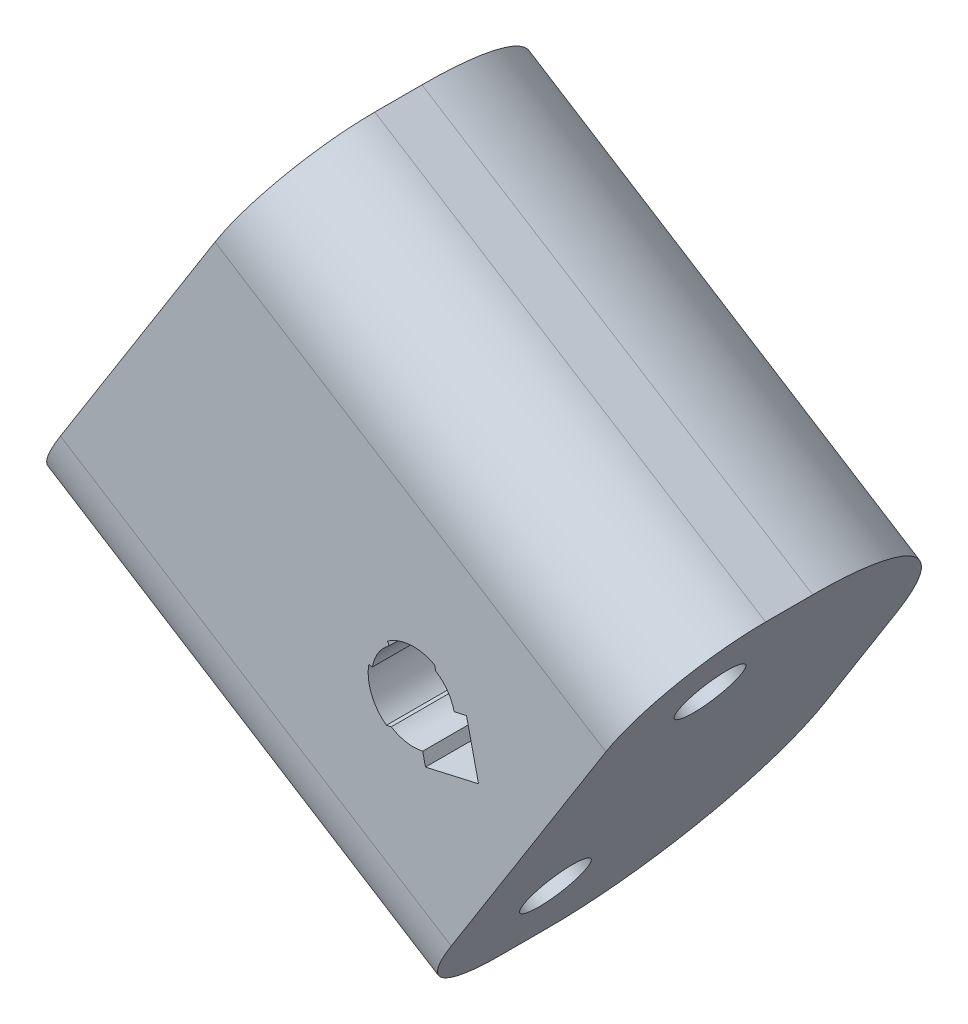
ISO-10303-21;
HEADER;
FILE_DESCRIPTION(('STEP AP214'),'2;1');
FILE_NAME('part.step','',(''),(''),'','','');
FILE_SCHEMA(('AUTOMOTIVE_DESIGN { 1 0 10303 214 1 1 1 1 }'));
ENDSEC;
DATA;
#1=APPLICATION_CONTEXT('core data for automotive mechanical design processes');
#2=APPLICATION_PROTOCOL_DEFINITION('international standard','automotive_design',2000,#1);
#3=PRODUCT_CONTEXT('',#1,'mechanical');
#4=PRODUCT('Part','Part','',(#3));
#5=PRODUCT_RELATED_PRODUCT_CATEGORY('part','',(#4));
#6=PRODUCT_DEFINITION_FORMATION('','',#4);
#7=PRODUCT_DEFINITION_CONTEXT('part definition',#1,'design');
#8=PRODUCT_DEFINITION('design','',#6,#7);
#9=PRODUCT_DEFINITION_SHAPE('','',#8);
#10=(LENGTH_UNIT() NAMED_UNIT(*) SI_UNIT(.MILLI.,.METRE.));
#11=(NAMED_UNIT(*) PLANE_ANGLE_UNIT() SI_UNIT($,.RADIAN.));
#12=(NAMED_UNIT(*) SI_UNIT($,.STERADIAN.) SOLID_ANGLE_UNIT());
#13=UNCERTAINTY_MEASURE_WITH_UNIT(LENGTH_MEASURE(1.E-05),#10,'distance_accuracy_value','');
#14=(GEOMETRIC_REPRESENTATION_CONTEXT(3) GLOBAL_UNCERTAINTY_ASSIGNED_CONTEXT((#13)) GLOBAL_UNIT_ASSIGNED_CONTEXT((#10,
#11,#12)) REPRESENTATION_CONTEXT('',''));
#15=CARTESIAN_POINT('',(0.,0.,0.));
#16=DIRECTION('',(0.,0.,1.));
#17=DIRECTION('',(1.,0.,0.));
#18=AXIS2_PLACEMENT_3D('',#15,#16,#17);
#19=CARTESIAN_POINT('',(44.3935601259802,-18.5113506463066,-1.12499871142424));
#20=DIRECTION('',(-0.846104357870405,0.533017275135347,0.));
#21=DIRECTION('',(-0.533017275135347,-0.846104357870405,0.));
#22=AXIS2_PLACEMENT_3D('',#19,#20,#21);
#23=CYLINDRICAL_SURFACE('',#22,1.75);
#24=CARTESIAN_POINT('',(2.14887730640675,8.10137805080161,-1.12499871142424));
#25=DIRECTION('',(0.846104357870405,-0.533017275135347,0.));
#26=DIRECTION('',(0.533017275135347,0.846104357870405,0.));
#27=AXIS2_PLACEMENT_3D('',#24,#25,#26);
#28=CIRCLE('',#27,1.75);
#29=CARTESIAN_POINT('',(3.08165753789361,9.58206067707482,-1.12499871142424));
#30=VERTEX_POINT('',#29);
#31=EDGE_CURVE('E336',#30,#30,#28,.F.);
#32=ORIENTED_EDGE('',*,*,#31,.T.);
#33=EDGE_LOOP('',(#32));
#34=FACE_BOUND('',#33,.T.);
#35=CARTESIAN_POINT('',(23.7061857745139,-5.47900090841251,-1.12499871142424));
#36=DIRECTION('',(0.846104357870405,-0.533017275135347,0.));
#37=DIRECTION('',(0.533017275135347,0.846104357870405,0.));
#38=AXIS2_PLACEMENT_3D('',#35,#36,#37);
#39=CIRCLE('',#38,1.75);
#40=CARTESIAN_POINT('',(24.6389660060008,-3.9983182821393,-1.12499871142424));
#41=VERTEX_POINT('',#40);
#42=EDGE_CURVE('E328',#41,#41,#39,.F.);
#43=ORIENTED_EDGE('',*,*,#42,.F.);
#44=EDGE_LOOP('',(#43));
#45=FACE_BOUND('',#44,.T.);
#46=ADVANCED_FACE('F86',(#34,#45),#23,.F.);
#47=CARTESIAN_POINT('',(32.8004343917864,-36.914120429988,0.));
#48=DIRECTION('',(0.533017275135347,0.846104357870405,0.));
#49=DIRECTION('',(-0.846104357870405,0.533017275135347,0.));
#50=AXIS2_PLACEMENT_3D('',#47,#48,#49);
#51=PLANE('',#50);
#52=DIRECTION('',(0.,0.,-1.));
#53=VECTOR('',#52,1.);
#54=CARTESIAN_POINT('',(-9.44424842778705,-10.3013917328797,0.));
#55=LINE('',#54,#53);
#56=CARTESIAN_POINT('',(-9.44424842778706,-10.3013917328797,-1.12499871142424));
#57=VERTEX_POINT('',#56);
#58=CARTESIAN_POINT('',(-9.44424842778705,-10.3013917328797,-3.72499871142426));
#59=VERTEX_POINT('',#58);
#60=EDGE_CURVE('E339',#57,#59,#55,.T.);
#61=ORIENTED_EDGE('',*,*,#60,.T.);
#62=DIRECTION('',(-0.846104357870405,0.533017275135347,0.));
#63=VECTOR('',#62,1.);
#64=CARTESIAN_POINT('',(12.1130600403201,-23.8817706920938,-3.72499871142427));
#65=LINE('',#64,#63);
#66=CARTESIAN_POINT('',(12.1130600403201,-23.8817706920938,-3.72499871142427));
#67=VERTEX_POINT('',#66);
#68=EDGE_CURVE('E376',#59,#67,#65,.F.);
#69=ORIENTED_EDGE('',*,*,#68,.T.);
#70=DIRECTION('',(0.,0.,-1.));
#71=VECTOR('',#70,1.);
#72=CARTESIAN_POINT('',(12.1130600403201,-23.8817706920938,0.));
#73=LINE('',#72,#71);
#74=CARTESIAN_POINT('',(12.1130600403201,-23.8817706920938,-1.12499871142424));
#75=VERTEX_POINT('',#74);
#76=EDGE_CURVE('E322',#75,#67,#73,.T.);
#77=ORIENTED_EDGE('',*,*,#76,.F.);
#78=DIRECTION('',(-0.846104357870405,0.533017275135347,0.));
#79=VECTOR('',#78,1.);
#80=CARTESIAN_POINT('',(32.8004343917864,-36.914120429988,-1.12499871142424));
#81=LINE('',#80,#79);
#82=EDGE_CURVE('E342',#75,#57,#81,.T.);
#83=ORIENTED_EDGE('',*,*,#82,.T.);
#84=EDGE_LOOP('',(#61,#69,#77,#83));
#85=FACE_BOUND('',#84,.T.);
#86=ADVANCED_FACE('F457',(#85),#51,.F.);
#87=CARTESIAN_POINT('',(35.8652837238147,-32.0490203722331,-1.12499871142424));
#88=DIRECTION('',(-0.846104357870405,0.533017275135347,0.));
#89=DIRECTION('',(-0.533017275135347,-0.846104357870405,0.));
#90=AXIS2_PLACEMENT_3D('',#87,#88,#89);
#91=CYLINDRICAL_SURFACE('',#90,5.75);
#92=ORIENTED_EDGE('',*,*,#82,.F.);
#93=CARTESIAN_POINT('',(15.1779093723484,-19.016670634339,-1.12499871142424));
#94=DIRECTION('',(0.846104357870405,-0.533017275135347,0.));
#95=DIRECTION('',(0.533017275135347,0.846104357870405,0.));
#96=AXIS2_PLACEMENT_3D('',#93,#94,#95);
#97=CIRCLE('',#96,5.75);
#98=CARTESIAN_POINT('',(15.1779093723484,-19.016670634339,4.62500128857576));
#99=VERTEX_POINT('',#98);
#100=EDGE_CURVE('E319',#99,#75,#97,.T.);
#101=ORIENTED_EDGE('',*,*,#100,.F.);
#102=DIRECTION('',(-0.846104357870405,0.533017275135347,0.));
#103=VECTOR('',#102,1.);
#104=CARTESIAN_POINT('',(35.8652837238147,-32.0490203722331,4.62500128857576));
#105=LINE('',#104,#103);
#106=CARTESIAN_POINT('',(-6.37939909575881,-5.43629167512487,4.62500128857576));
#107=VERTEX_POINT('',#106);
#108=EDGE_CURVE('E346',#99,#107,#105,.T.);
#109=ORIENTED_EDGE('',*,*,#108,.T.);
#110=CARTESIAN_POINT('',(-6.37939909575881,-5.43629167512487,-1.12499871142424));
#111=DIRECTION('',(0.846104357870405,-0.533017275135347,0.));
#112=DIRECTION('',(0.533017275135347,0.846104357870405,0.));
#113=AXIS2_PLACEMENT_3D('',#110,#111,#112);
#114=CIRCLE('',#113,5.75);
#115=EDGE_CURVE('E343',#107,#57,#114,.T.);
#116=ORIENTED_EDGE('',*,*,#115,.T.);
#117=EDGE_LOOP('',(#92,#101,#109,#116));
#118=FACE_BOUND('',#117,.T.);
#119=ADVANCED_FACE('F463',(#118),#91,.T.);
#120=CARTESIAN_POINT('',(40.1294219248975,-25.2801855092699,4.62500128857576));
#121=DIRECTION('',(0.,0.,-1.));
#122=DIRECTION('',(0.,1.,0.));
#123=AXIS2_PLACEMENT_3D('',#120,#121,#122);
#124=PLANE('',#123);
#125=DIRECTION('',(0.985675378963754,-0.168653631163577,0.));
#126=VECTOR('',#125,1.);
#127=CARTESIAN_POINT('',(-0.998984788937356,-5.83844358180357,4.62500128857576));
#128=LINE('',#127,#126);
#129=CARTESIAN_POINT('',(10.6320764419937,-7.82857212995165,4.62500128857576));
#130=VERTEX_POINT('',#129);
#131=CARTESIAN_POINT('',(10.8292115177865,-7.86230285618436,4.62500128857576));
#132=VERTEX_POINT('',#131);
#133=EDGE_CURVE('E395',#130,#132,#128,.T.);
#134=ORIENTED_EDGE('',*,*,#133,.T.);
#135=CARTESIAN_POINT('',(13.0962648894031,-8.25020620786059,4.62500128857576));
#136=DIRECTION('',(0.,0.,-1.));
#137=DIRECTION('',(0.,1.,0.));
#138=AXIS2_PLACEMENT_3D('',#135,#136,#137);
#139=CIRCLE('',#138,2.3);
#140=CARTESIAN_POINT('',(11.7675051674364,-6.37286830506339,4.62500128857576));
#141=VERTEX_POINT('',#140);
#142=EDGE_CURVE('E305',#141,#132,#139,.F.);
#143=ORIENTED_EDGE('',*,*,#142,.F.);
#144=DIRECTION('',(0.577721618246388,-0.816233870781392,0.));
#145=VECTOR('',#144,1.);
#146=CARTESIAN_POINT('',(4.83479196682832,3.42201412970863,4.62500128857576));
#147=LINE('',#146,#145);
#148=CARTESIAN_POINT('',(11.6519608437872,-6.20962153090711,4.62500128857576));
#149=VERTEX_POINT('',#148);
#150=EDGE_CURVE('E302',#149,#141,#147,.T.);
#151=ORIENTED_EDGE('',*,*,#150,.F.);
#152=CARTESIAN_POINT('',(13.0962648894031,-8.25020620786059,4.62500128857576));
#153=DIRECTION('',(0.,0.,-1.));
#154=DIRECTION('',(0.,1.,0.));
#155=AXIS2_PLACEMENT_3D('',#152,#153,#154);
#156=CIRCLE('',#155,2.5);
#157=CARTESIAN_POINT('',(14.2619127669846,-6.03858575545703,4.62500128857576));
#158=VERTEX_POINT('',#157);
#159=EDGE_CURVE('E237',#158,#149,#156,.F.);
#160=ORIENTED_EDGE('',*,*,#159,.F.);
#161=DIRECTION('',(0.221385999303831,-0.975186258779442,0.));
#162=VECTOR('',#161,1.);
#163=CARTESIAN_POINT('',(19.6838436344012,-29.9217242311665,4.62500128857576));
#164=LINE('',#163,#162);
#165=CARTESIAN_POINT('',(14.3222046222145,-6.3041661847587,4.62500128857576));
#166=VERTEX_POINT('',#165);
#167=EDGE_CURVE('E383',#158,#166,#164,.T.);
#168=ORIENTED_EDGE('',*,*,#167,.T.);
#169=CARTESIAN_POINT('',(13.0962648894031,-8.25020620786059,4.62500128857576));
#170=DIRECTION('',(0.,0.,-1.));
#171=DIRECTION('',(0.,1.,0.));
#172=AXIS2_PLACEMENT_3D('',#169,#170,#171);
#173=CIRCLE('',#172,2.3);
#174=CARTESIAN_POINT('',(15.3391932845958,-7.74101840946177,4.62500128857576));
#175=VERTEX_POINT('',#174);
#176=EDGE_CURVE('E415',#175,#166,#173,.F.);
#177=ORIENTED_EDGE('',*,*,#176,.F.);
#178=DIRECTION('',(-0.97518625877944,-0.221385999303837,0.));
#179=VECTOR('',#178,1.);
#180=CARTESIAN_POINT('',(2.42302934077073,-10.6732355486315,4.62500128857576));
#181=LINE('',#180,#179);
#182=CARTESIAN_POINT('',(16.0218236657415,-7.58604820994908,4.62500128857576));
#183=VERTEX_POINT('',#182);
#184=EDGE_CURVE('E430',#183,#175,#181,.T.);
#185=ORIENTED_EDGE('',*,*,#184,.F.);
#186=DIRECTION('',(0.221385999303835,-0.975186258779441,0.));
#187=VECTOR('',#186,1.);
#188=CARTESIAN_POINT('',(13.5987943249708,3.08718733868242,4.62500128857576));
#189=LINE('',#188,#187);
#190=CARTESIAN_POINT('',(16.6859816636529,-10.5116069862873,4.62500128857576));
#191=VERTEX_POINT('',#190);
#192=EDGE_CURVE('E433',#183,#191,#189,.T.);
#193=ORIENTED_EDGE('',*,*,#192,.T.);
#194=DIRECTION('',(0.975186258779432,0.221385999303876,0.));
#195=VECTOR('',#194,1.);
#196=CARTESIAN_POINT('',(3.08718733868289,-13.5987943249701,4.62500128857576));
#197=LINE('',#196,#195);
#198=CARTESIAN_POINT('',(13.7604228873148,-11.1757649841989,4.62500128857576));
#199=VERTEX_POINT('',#198);
#200=EDGE_CURVE('E437',#199,#191,#197,.T.);
#201=ORIENTED_EDGE('',*,*,#200,.F.);
#202=DIRECTION('',(-0.221385999303876,0.975186258779431,0.));
#203=VECTOR('',#202,1.);
#204=CARTESIAN_POINT('',(10.6732355486319,2.42302934077127,4.62500128857576));
#205=LINE('',#204,#203);
#206=CARTESIAN_POINT('',(13.605452687802,-10.4931346030533,4.62500128857576));
#207=VERTEX_POINT('',#206);
#208=EDGE_CURVE('E399',#199,#207,#205,.T.);
#209=ORIENTED_EDGE('',*,*,#208,.T.);
#210=CARTESIAN_POINT('',(13.0962648894031,-8.25020620786059,4.62500128857576));
#211=DIRECTION('',(0.,0.,-1.));
#212=DIRECTION('',(0.,1.,0.));
#213=AXIS2_PLACEMENT_3D('',#210,#211,#212);
#214=CIRCLE('',#213,2.3);
#215=CARTESIAN_POINT('',(11.8703251565918,-10.1962462309625,4.62500128857576));
#216=VERTEX_POINT('',#215);
#217=EDGE_CURVE('E396',#216,#207,#214,.F.);
#218=ORIENTED_EDGE('',*,*,#217,.F.);
#219=DIRECTION('',(-0.975186258779435,-0.22138599930386,0.));
#220=VECTOR('',#219,1.);
#221=CARTESIAN_POINT('',(35.4878832030005,-4.8346072187749,4.62500128857576));
#222=LINE('',#221,#220);
#223=CARTESIAN_POINT('',(11.6047447272902,-10.2565380861924,4.62500128857576));
#224=VERTEX_POINT('',#223);
#225=EDGE_CURVE('E12',#216,#224,#222,.T.);
#226=ORIENTED_EDGE('',*,*,#225,.T.);
#227=CARTESIAN_POINT('',(13.0962648894031,-8.25020620786059,4.62500128857576));
#228=DIRECTION('',(0.,0.,-1.));
#229=DIRECTION('',(0.,1.,0.));
#230=AXIS2_PLACEMENT_3D('',#227,#228,#229);
#231=CIRCLE('',#230,2.5);
#232=EDGE_CURVE('E393',#130,#224,#231,.F.);
#233=ORIENTED_EDGE('',*,*,#232,.F.);
#234=EDGE_LOOP('',(#134,#143,#151,#160,#168,#177,#185,#193,#201,#209,#218,#226,#233));
#235=FACE_BOUND('',#234,.T.);
#236=ORIENTED_EDGE('',*,*,#108,.F.);
#237=DIRECTION('',(-0.533017275135347,-0.846104357870405,0.));
#238=VECTOR('',#237,1.);
#239=CARTESIAN_POINT('',(19.4420475734311,-12.2478357713757,4.62500128857576));
#240=LINE('',#239,#238);
#241=CARTESIAN_POINT('',(23.7061857745139,-5.47900090841252,4.62500128857576));
#242=VERTEX_POINT('',#241);
#243=EDGE_CURVE('E316',#242,#99,#240,.T.);
#244=ORIENTED_EDGE('',*,*,#243,.F.);
#245=DIRECTION('',(-0.846104357870405,0.533017275135347,0.));
#246=VECTOR('',#245,1.);
#247=CARTESIAN_POINT('',(44.3935601259802,-18.5113506463066,4.62500128857576));
#248=LINE('',#247,#246);
#249=CARTESIAN_POINT('',(2.14887730640674,8.10137805080161,4.62500128857576));
#250=VERTEX_POINT('',#249);
#251=EDGE_CURVE('E350',#242,#250,#248,.T.);
#252=ORIENTED_EDGE('',*,*,#251,.T.);
#253=DIRECTION('',(-0.533017275135347,-0.846104357870405,0.));
#254=VECTOR('',#253,1.);
#255=CARTESIAN_POINT('',(-2.11526089467602,1.33254318783837,4.62500128857576));
#256=LINE('',#255,#254);
#257=EDGE_CURVE('E347',#250,#107,#256,.T.);
#258=ORIENTED_EDGE('',*,*,#257,.T.);
#259=EDGE_LOOP('',(#236,#244,#252,#258));
#260=FACE_BOUND('',#259,.T.);
#261=ADVANCED_FACE('F410',(#235,#260),#124,.F.);
#262=CARTESIAN_POINT('',(44.3935601259802,-18.5113506463066,-1.12499871142424));
#263=DIRECTION('',(-0.846104357870405,0.533017275135347,0.));
#264=DIRECTION('',(-0.533017275135347,-0.846104357870405,0.));
#265=AXIS2_PLACEMENT_3D('',#262,#263,#264);
#266=CYLINDRICAL_SURFACE('',#265,5.75);
#267=ORIENTED_EDGE('',*,*,#251,.F.);
#268=CARTESIAN_POINT('',(23.7061857745139,-5.47900090841252,-1.12499871142424));
#269=DIRECTION('',(0.846104357870405,-0.533017275135347,0.));
#270=DIRECTION('',(0.533017275135347,0.846104357870405,0.));
#271=AXIS2_PLACEMENT_3D('',#268,#269,#270);
#272=CIRCLE('',#271,5.75);
#273=CARTESIAN_POINT('',(26.7710351065421,-0.613900850657684,-1.12499871142424));
#274=VERTEX_POINT('',#273);
#275=EDGE_CURVE('E313',#274,#242,#272,.T.);
#276=ORIENTED_EDGE('',*,*,#275,.F.);
#277=DIRECTION('',(-0.846104357870405,0.533017275135347,0.));
#278=VECTOR('',#277,1.);
#279=CARTESIAN_POINT('',(47.4584094580085,-13.6462505885518,-1.12499871142424));
#280=LINE('',#279,#278);
#281=CARTESIAN_POINT('',(5.21372663843499,12.9664781085564,-1.12499871142424));
#282=VERTEX_POINT('',#281);
#283=EDGE_CURVE('E331',#274,#282,#280,.T.);
#284=ORIENTED_EDGE('',*,*,#283,.T.);
#285=CARTESIAN_POINT('',(2.14887730640674,8.10137805080161,-1.12499871142424));
#286=DIRECTION('',(0.846104357870405,-0.533017275135347,0.));
#287=DIRECTION('',(0.533017275135347,0.846104357870405,0.));
#288=AXIS2_PLACEMENT_3D('',#285,#286,#287);
#289=CIRCLE('',#288,5.75);
#290=EDGE_CURVE('E351',#282,#250,#289,.T.);
#291=ORIENTED_EDGE('',*,*,#290,.T.);
#292=EDGE_LOOP('',(#267,#276,#284,#291));
#293=FACE_BOUND('',#292,.T.);
#294=ADVANCED_FACE('F476',(#293),#266,.T.);
#295=CARTESIAN_POINT('',(47.4584094580085,-13.6462505885518,0.));
#296=DIRECTION('',(0.533017275135347,0.846104357870405,0.));
#297=DIRECTION('',(-0.846104357870405,0.533017275135347,0.));
#298=AXIS2_PLACEMENT_3D('',#295,#296,#297);
#299=PLANE('',#298);
#300=DIRECTION('',(0.,0.,1.));
#301=VECTOR('',#300,1.);
#302=CARTESIAN_POINT('',(26.7710351065421,-0.613900850657682,0.));
#303=LINE('',#302,#301);
#304=CARTESIAN_POINT('',(26.7710351065421,-0.613900850657682,-3.72499871142427));
#305=VERTEX_POINT('',#304);
#306=EDGE_CURVE('E311',#305,#274,#303,.T.);
#307=ORIENTED_EDGE('',*,*,#306,.F.);
#308=DIRECTION('',(-0.846104357870405,0.533017275135347,0.));
#309=VECTOR('',#308,1.);
#310=CARTESIAN_POINT('',(47.4584094580085,-13.6462505885518,-3.72499871142427));
#311=LINE('',#310,#309);
#312=CARTESIAN_POINT('',(5.213726638435,12.9664781085564,-3.72499871142427));
#313=VERTEX_POINT('',#312);
#314=EDGE_CURVE('E356',#305,#313,#311,.T.);
#315=ORIENTED_EDGE('',*,*,#314,.T.);
#316=DIRECTION('',(0.,0.,-1.));
#317=VECTOR('',#316,1.);
#318=CARTESIAN_POINT('',(5.213726638435,12.9664781085564,0.));
#319=LINE('',#318,#317);
#320=EDGE_CURVE('E335',#282,#313,#319,.T.);
#321=ORIENTED_EDGE('',*,*,#320,.F.);
#322=ORIENTED_EDGE('',*,*,#283,.F.);
#323=EDGE_LOOP('',(#307,#315,#321,#322));
#324=FACE_BOUND('',#323,.T.);
#325=ADVANCED_FACE('F479',(#324),#299,.T.);
#326=CARTESIAN_POINT('',(35.8652837238147,-32.0490203722331,-1.12499871142424));
#327=DIRECTION('',(-0.846104357870405,0.533017275135347,0.));
#328=DIRECTION('',(-0.533017275135347,-0.846104357870405,0.));
#329=AXIS2_PLACEMENT_3D('',#326,#327,#328);
#330=CYLINDRICAL_SURFACE('',#329,1.75);
#331=CARTESIAN_POINT('',(-6.3793990957588,-5.43629167512487,-1.12499871142424));
#332=DIRECTION('',(0.846104357870405,-0.533017275135347,0.));
#333=DIRECTION('',(0.533017275135347,0.846104357870405,0.));
#334=AXIS2_PLACEMENT_3D('',#331,#332,#333);
#335=CIRCLE('',#334,1.75);
#336=CARTESIAN_POINT('',(-5.44661886427194,-3.95560904885166,-1.12499871142424));
#337=VERTEX_POINT('',#336);
#338=EDGE_CURVE('E332',#337,#337,#335,.F.);
#339=ORIENTED_EDGE('',*,*,#338,.T.);
#340=EDGE_LOOP('',(#339));
#341=FACE_BOUND('',#340,.T.);
#342=CARTESIAN_POINT('',(15.1779093723484,-19.016670634339,-1.12499871142424));
#343=DIRECTION('',(0.846104357870405,-0.533017275135347,0.));
#344=DIRECTION('',(0.533017275135347,0.846104357870405,0.));
#345=AXIS2_PLACEMENT_3D('',#342,#343,#344);
#346=CIRCLE('',#345,1.75);
#347=CARTESIAN_POINT('',(16.1106896038352,-17.5359880080658,-1.12499871142424));
#348=VERTEX_POINT('',#347);
#349=EDGE_CURVE('E325',#348,#348,#346,.F.);
#350=ORIENTED_EDGE('',*,*,#349,.F.);
#351=EDGE_LOOP('',(#350));
#352=FACE_BOUND('',#351,.T.);
#353=ADVANCED_FACE('F483',(#341,#352),#330,.F.);
#354=CARTESIAN_POINT('',(-2.11526089467602,1.33254318783837,0.));
#355=DIRECTION('',(0.846104357870405,-0.533017275135347,0.));
#356=DIRECTION('',(0.533017275135347,0.846104357870405,0.));
#357=AXIS2_PLACEMENT_3D('',#354,#355,#356);
#358=PLANE('',#357);
#359=ORIENTED_EDGE('',*,*,#320,.T.);
#360=CARTESIAN_POINT('',(-0.116446112918479,4.50543452985238,-3.72499871142427));
#361=DIRECTION('',(0.846104357870405,-0.533017275135347,0.));
#362=DIRECTION('',(0.533017275135347,0.846104357870405,0.));
#363=AXIS2_PLACEMENT_3D('',#360,#361,#362);
#364=CIRCLE('',#363,10.);
#365=CARTESIAN_POINT('',(-0.116446112918479,4.50543452985237,-13.7249987114243));
#366=VERTEX_POINT('',#365);
#367=EDGE_CURVE('E365',#313,#366,#364,.F.);
#368=ORIENTED_EDGE('',*,*,#367,.T.);
#369=DIRECTION('',(0.533017275135347,0.846104357870405,0.));
#370=VECTOR('',#369,1.);
#371=CARTESIAN_POINT('',(5.21372663843499,12.9664781085564,-13.7249987114243));
#372=LINE('',#371,#370);
#373=CARTESIAN_POINT('',(-4.11407567643359,-1.84034815417567,-13.7249987114243));
#374=VERTEX_POINT('',#373);
#375=EDGE_CURVE('E304',#374,#366,#372,.T.);
#376=ORIENTED_EDGE('',*,*,#375,.F.);
#377=CARTESIAN_POINT('',(-4.11407567643358,-1.84034815417566,-3.72499871142426));
#378=DIRECTION('',(0.846104357870405,-0.533017275135347,0.));
#379=DIRECTION('',(0.533017275135347,0.846104357870405,0.));
#380=AXIS2_PLACEMENT_3D('',#377,#378,#379);
#381=CIRCLE('',#380,10.);
#382=EDGE_CURVE('E363',#374,#59,#381,.F.);
#383=ORIENTED_EDGE('',*,*,#382,.T.);
#384=ORIENTED_EDGE('',*,*,#60,.F.);
#385=ORIENTED_EDGE('',*,*,#115,.F.);
#386=ORIENTED_EDGE('',*,*,#257,.F.);
#387=ORIENTED_EDGE('',*,*,#290,.F.);
#388=EDGE_LOOP('',(#359,#368,#376,#383,#384,#385,#386,#387));
#389=FACE_BOUND('',#388,.T.);
#390=ORIENTED_EDGE('',*,*,#31,.F.);
#391=EDGE_LOOP('',(#390));
#392=FACE_BOUND('',#391,.T.);
#393=ORIENTED_EDGE('',*,*,#338,.F.);
#394=EDGE_LOOP('',(#393));
#395=FACE_BOUND('',#394,.T.);
#396=ADVANCED_FACE('F468',(#389,#392,#395),#358,.F.);
#397=CARTESIAN_POINT('',(19.4420475734311,-12.2478357713757,-13.7249987114243));
#398=DIRECTION('',(0.,0.,-1.));
#399=DIRECTION('',(-1.,0.,0.));
#400=AXIS2_PLACEMENT_3D('',#397,#398,#399);
#401=PLANE('',#400);
#402=CARTESIAN_POINT('',(13.0962648894031,-8.25020620786059,-13.7249987114243));
#403=DIRECTION('',(0.,0.,-1.));
#404=DIRECTION('',(-1.,0.,0.));
#405=AXIS2_PLACEMENT_3D('',#402,#403,#404);
#406=CIRCLE('',#405,2.3);
#407=CARTESIAN_POINT('',(10.8292115177865,-7.86230285618436,-13.7249987114243));
#408=VERTEX_POINT('',#407);
#409=CARTESIAN_POINT('',(11.7675051674364,-6.37286830506339,-13.7249987114243));
#410=VERTEX_POINT('',#409);
#411=EDGE_CURVE('E250',#408,#410,#406,.T.);
#412=ORIENTED_EDGE('',*,*,#411,.F.);
#413=DIRECTION('',(-0.985675378963754,0.168653631163577,0.));
#414=VECTOR('',#413,1.);
#415=CARTESIAN_POINT('',(-0.998984788937357,-5.83844358180357,-13.7249987114243));
#416=LINE('',#415,#414);
#417=CARTESIAN_POINT('',(10.6320764419937,-7.82857212995165,-13.7249987114243));
#418=VERTEX_POINT('',#417);
#419=EDGE_CURVE('E279',#408,#418,#416,.T.);
#420=ORIENTED_EDGE('',*,*,#419,.T.);
#421=CARTESIAN_POINT('',(13.0962648894031,-8.25020620786059,-13.7249987114243));
#422=DIRECTION('',(0.,0.,-1.));
#423=DIRECTION('',(-1.,0.,0.));
#424=AXIS2_PLACEMENT_3D('',#421,#422,#423);
#425=CIRCLE('',#424,2.5);
#426=CARTESIAN_POINT('',(11.6047447272902,-10.2565380861924,-13.7249987114243));
#427=VERTEX_POINT('',#426);
#428=EDGE_CURVE('E277',#427,#418,#425,.T.);
#429=ORIENTED_EDGE('',*,*,#428,.F.);
#430=DIRECTION('',(0.975186258779435,0.22138599930386,0.));
#431=VECTOR('',#430,1.);
#432=CARTESIAN_POINT('',(11.6047447272901,-10.2565380861924,-13.7249987114243));
#433=LINE('',#432,#431);
#434=CARTESIAN_POINT('',(11.8703251565918,-10.1962462309625,-13.7249987114243));
#435=VERTEX_POINT('',#434);
#436=EDGE_CURVE('E95',#427,#435,#433,.T.);
#437=ORIENTED_EDGE('',*,*,#436,.T.);
#438=CARTESIAN_POINT('',(13.0962648894031,-8.25020620786059,-13.7249987114243));
#439=DIRECTION('',(0.,0.,-1.));
#440=DIRECTION('',(-1.,0.,0.));
#441=AXIS2_PLACEMENT_3D('',#438,#439,#440);
#442=CIRCLE('',#441,2.3);
#443=CARTESIAN_POINT('',(13.605452687802,-10.4931346030533,-13.7249987114243));
#444=VERTEX_POINT('',#443);
#445=EDGE_CURVE('E274',#444,#435,#442,.T.);
#446=ORIENTED_EDGE('',*,*,#445,.F.);
#447=DIRECTION('',(0.221385999303876,-0.975186258779432,0.));
#448=VECTOR('',#447,1.);
#449=CARTESIAN_POINT('',(10.6732355486319,2.42302934077127,-13.7249987114243));
#450=LINE('',#449,#448);
#451=CARTESIAN_POINT('',(13.7604228873148,-11.1757649841989,-13.7249987114243));
#452=VERTEX_POINT('',#451);
#453=EDGE_CURVE('E271',#444,#452,#450,.T.);
#454=ORIENTED_EDGE('',*,*,#453,.T.);
#455=DIRECTION('',(-0.975186258779431,-0.221385999303876,0.));
#456=VECTOR('',#455,1.);
#457=CARTESIAN_POINT('',(3.08718733868289,-13.5987943249701,-13.7249987114243));
#458=LINE('',#457,#456);
#459=CARTESIAN_POINT('',(16.6859816636529,-10.5116069862873,-13.7249987114243));
#460=VERTEX_POINT('',#459);
#461=EDGE_CURVE('E268',#460,#452,#458,.T.);
#462=ORIENTED_EDGE('',*,*,#461,.F.);
#463=DIRECTION('',(-0.221385999303835,0.975186258779441,0.));
#464=VECTOR('',#463,1.);
#465=CARTESIAN_POINT('',(13.5987943249708,3.08718733868242,-13.7249987114243));
#466=LINE('',#465,#464);
#467=CARTESIAN_POINT('',(16.0218236657415,-7.58604820994908,-13.7249987114243));
#468=VERTEX_POINT('',#467);
#469=EDGE_CURVE('E265',#460,#468,#466,.T.);
#470=ORIENTED_EDGE('',*,*,#469,.T.);
#471=DIRECTION('',(0.97518625877944,0.221385999303837,0.));
#472=VECTOR('',#471,1.);
#473=CARTESIAN_POINT('',(2.42302934077073,-10.6732355486315,-13.7249987114243));
#474=LINE('',#473,#472);
#475=CARTESIAN_POINT('',(15.3391932845958,-7.74101840946177,-13.7249987114243));
#476=VERTEX_POINT('',#475);
#477=EDGE_CURVE('E259',#476,#468,#474,.T.);
#478=ORIENTED_EDGE('',*,*,#477,.F.);
#479=CARTESIAN_POINT('',(13.0962648894031,-8.25020620786059,-13.7249987114243));
#480=DIRECTION('',(0.,0.,-1.));
#481=DIRECTION('',(-1.,0.,0.));
#482=AXIS2_PLACEMENT_3D('',#479,#480,#481);
#483=CIRCLE('',#482,2.3);
#484=CARTESIAN_POINT('',(14.3222046222145,-6.3041661847587,-13.7249987114243));
#485=VERTEX_POINT('',#484);
#486=EDGE_CURVE('E256',#485,#476,#483,.T.);
#487=ORIENTED_EDGE('',*,*,#486,.F.);
#488=DIRECTION('',(-0.221385999303831,0.975186258779442,0.));
#489=VECTOR('',#488,1.);
#490=CARTESIAN_POINT('',(14.3222046222145,-6.3041661847587,-13.7249987114243));
#491=LINE('',#490,#489);
#492=CARTESIAN_POINT('',(14.2619127669846,-6.03858575545703,-13.7249987114243));
#493=VERTEX_POINT('',#492);
#494=EDGE_CURVE('E255',#485,#493,#491,.T.);
#495=ORIENTED_EDGE('',*,*,#494,.T.);
#496=CARTESIAN_POINT('',(13.0962648894031,-8.25020620786059,-13.7249987114243));
#497=DIRECTION('',(0.,0.,-1.));
#498=DIRECTION('',(-1.,0.,0.));
#499=AXIS2_PLACEMENT_3D('',#496,#497,#498);
#500=CIRCLE('',#499,2.5);
#501=CARTESIAN_POINT('',(11.6519608437872,-6.20962153090711,-13.7249987114243));
#502=VERTEX_POINT('',#501);
#503=EDGE_CURVE('E234',#502,#493,#500,.T.);
#504=ORIENTED_EDGE('',*,*,#503,.F.);
#505=DIRECTION('',(-0.577721618246388,0.816233870781392,0.));
#506=VECTOR('',#505,1.);
#507=CARTESIAN_POINT('',(4.83479196682832,3.42201412970863,-13.7249987114243));
#508=LINE('',#507,#506);
#509=EDGE_CURVE('E245',#410,#502,#508,.T.);
#510=ORIENTED_EDGE('',*,*,#509,.F.);
#511=EDGE_LOOP('',(#412,#420,#429,#437,#446,#454,#462,#470,#478,#487,#495,#504,#510));
#512=FACE_BOUND('',#511,.T.);
#513=ORIENTED_EDGE('',*,*,#375,.T.);
#514=DIRECTION('',(-0.846104357870405,0.533017275135347,0.));
#515=VECTOR('',#514,1.);
#516=CARTESIAN_POINT('',(21.4408623551887,-9.07494442936174,-13.7249987114243));
#517=LINE('',#516,#515);
#518=CARTESIAN_POINT('',(21.4408623551887,-9.07494442936174,-13.7249987114243));
#519=VERTEX_POINT('',#518);
#520=EDGE_CURVE('E370',#366,#519,#517,.F.);
#521=ORIENTED_EDGE('',*,*,#520,.T.);
#522=DIRECTION('',(-0.533017275135347,-0.846104357870405,0.));
#523=VECTOR('',#522,1.);
#524=CARTESIAN_POINT('',(19.4420475734311,-12.2478357713757,-13.7249987114243));
#525=LINE('',#524,#523);
#526=CARTESIAN_POINT('',(17.4432327916736,-15.4207271133898,-13.7249987114243));
#527=VERTEX_POINT('',#526);
#528=EDGE_CURVE('E308',#519,#527,#525,.T.);
#529=ORIENTED_EDGE('',*,*,#528,.T.);
#530=DIRECTION('',(-0.846104357870405,0.533017275135347,0.));
#531=VECTOR('',#530,1.);
#532=CARTESIAN_POINT('',(-4.11407567643359,-1.84034815417566,-13.7249987114243));
#533=LINE('',#532,#531);
#534=EDGE_CURVE('E367',#527,#374,#533,.T.);
#535=ORIENTED_EDGE('',*,*,#534,.T.);
#536=EDGE_LOOP('',(#513,#521,#529,#535));
#537=FACE_BOUND('',#536,.T.);
#538=ADVANCED_FACE('F252',(#512,#537),#401,.T.);
#539=CARTESIAN_POINT('',(19.4420475734311,-12.2478357713757,0.));
#540=DIRECTION('',(0.846104357870405,-0.533017275135347,0.));
#541=DIRECTION('',(0.533017275135347,0.846104357870405,0.));
#542=AXIS2_PLACEMENT_3D('',#539,#540,#541);
#543=PLANE('',#542);
#544=ORIENTED_EDGE('',*,*,#528,.F.);
#545=CARTESIAN_POINT('',(21.4408623551887,-9.07494442936173,-3.72499871142427));
#546=DIRECTION('',(0.846104357870405,-0.533017275135347,0.));
#547=DIRECTION('',(0.533017275135347,0.846104357870405,0.));
#548=AXIS2_PLACEMENT_3D('',#545,#546,#547);
#549=CIRCLE('',#548,10.);
#550=EDGE_CURVE('E374',#519,#305,#549,.T.);
#551=ORIENTED_EDGE('',*,*,#550,.T.);
#552=ORIENTED_EDGE('',*,*,#306,.T.);
#553=ORIENTED_EDGE('',*,*,#275,.T.);
#554=ORIENTED_EDGE('',*,*,#243,.T.);
#555=ORIENTED_EDGE('',*,*,#100,.T.);
#556=ORIENTED_EDGE('',*,*,#76,.T.);
#557=CARTESIAN_POINT('',(17.4432327916736,-15.4207271133898,-3.72499871142427));
#558=DIRECTION('',(0.846104357870405,-0.533017275135347,0.));
#559=DIRECTION('',(0.533017275135347,0.846104357870405,0.));
#560=AXIS2_PLACEMENT_3D('',#557,#558,#559);
#561=CIRCLE('',#560,10.);
#562=EDGE_CURVE('E372',#67,#527,#561,.T.);
#563=ORIENTED_EDGE('',*,*,#562,.T.);
#564=EDGE_LOOP('',(#544,#551,#552,#553,#554,#555,#556,#563));
#565=FACE_BOUND('',#564,.T.);
#566=ORIENTED_EDGE('',*,*,#349,.T.);
#567=EDGE_LOOP('',(#566));
#568=FACE_BOUND('',#567,.T.);
#569=ORIENTED_EDGE('',*,*,#42,.T.);
#570=EDGE_LOOP('',(#569));
#571=FACE_BOUND('',#570,.T.);
#572=ADVANCED_FACE('F557',(#565,#568,#571),#543,.T.);
#573=CARTESIAN_POINT('',(13.0962648894031,-8.25020620786059,12.7810627416351));
#574=DIRECTION('',(0.,0.,-1.));
#575=DIRECTION('',(-1.,0.,0.));
#576=AXIS2_PLACEMENT_3D('',#573,#574,#575);
#577=CYLINDRICAL_SURFACE('',#576,2.3);
#578=ORIENTED_EDGE('',*,*,#142,.T.);
#579=DIRECTION('',(0.,0.,-1.));
#580=VECTOR('',#579,1.);
#581=CARTESIAN_POINT('',(10.8292115177865,-7.86230285618436,12.7810627416351));
#582=LINE('',#581,#580);
#583=EDGE_CURVE('E282',#132,#408,#582,.T.);
#584=ORIENTED_EDGE('',*,*,#583,.T.);
#585=ORIENTED_EDGE('',*,*,#411,.T.);
#586=DIRECTION('',(0.,0.,-1.));
#587=VECTOR('',#586,1.);
#588=CARTESIAN_POINT('',(11.7675051674364,-6.37286830506339,12.7810627416351));
#589=LINE('',#588,#587);
#590=EDGE_CURVE('E241',#141,#410,#589,.T.);
#591=ORIENTED_EDGE('',*,*,#590,.F.);
#592=EDGE_LOOP('',(#578,#584,#585,#591));
#593=FACE_BOUND('',#592,.T.);
#594=ADVANCED_FACE('F404',(#593),#577,.F.);
#595=CARTESIAN_POINT('',(-0.998984788937357,-5.83844358180357,12.7810627416351));
#596=DIRECTION('',(-0.168653631163577,-0.985675378963754,0.));
#597=DIRECTION('',(0.985675378963754,-0.168653631163577,0.));
#598=AXIS2_PLACEMENT_3D('',#595,#596,#597);
#599=PLANE('',#598);
#600=DIRECTION('',(0.,0.,-1.));
#601=VECTOR('',#600,1.);
#602=CARTESIAN_POINT('',(10.6320764419937,-7.82857212995165,12.7810627416351));
#603=LINE('',#602,#601);
#604=EDGE_CURVE('E284',#130,#418,#603,.T.);
#605=ORIENTED_EDGE('',*,*,#604,.T.);
#606=ORIENTED_EDGE('',*,*,#419,.F.);
#607=ORIENTED_EDGE('',*,*,#583,.F.);
#608=ORIENTED_EDGE('',*,*,#133,.F.);
#609=EDGE_LOOP('',(#605,#606,#607,#608));
#610=FACE_BOUND('',#609,.T.);
#611=ADVANCED_FACE('F409',(#610),#599,.T.);
#612=CARTESIAN_POINT('',(13.0962648894031,-8.25020620786059,12.7810627416351));
#613=DIRECTION('',(0.,0.,-1.));
#614=DIRECTION('',(-1.,0.,0.));
#615=AXIS2_PLACEMENT_3D('',#612,#613,#614);
#616=CYLINDRICAL_SURFACE('',#615,2.5);
#617=ORIENTED_EDGE('',*,*,#232,.T.);
#618=DIRECTION('',(0.,0.,-1.));
#619=VECTOR('',#618,1.);
#620=CARTESIAN_POINT('',(11.6047447272902,-10.2565380861924,12.7810627416351));
#621=LINE('',#620,#619);
#622=EDGE_CURVE('E380',#224,#427,#621,.T.);
#623=ORIENTED_EDGE('',*,*,#622,.T.);
#624=ORIENTED_EDGE('',*,*,#428,.T.);
#625=ORIENTED_EDGE('',*,*,#604,.F.);
#626=EDGE_LOOP('',(#617,#623,#624,#625));
#627=FACE_BOUND('',#626,.T.);
#628=ADVANCED_FACE('F391',(#627),#616,.F.);
#629=CARTESIAN_POINT('',(13.0962648894031,-8.25020620786059,12.7810627416351));
#630=DIRECTION('',(0.,0.,-1.));
#631=DIRECTION('',(-1.,0.,0.));
#632=AXIS2_PLACEMENT_3D('',#629,#630,#631);
#633=CYLINDRICAL_SURFACE('',#632,2.3);
#634=ORIENTED_EDGE('',*,*,#217,.T.);
#635=DIRECTION('',(0.,0.,-1.));
#636=VECTOR('',#635,1.);
#637=CARTESIAN_POINT('',(13.605452687802,-10.4931346030533,12.7810627416351));
#638=LINE('',#637,#636);
#639=EDGE_CURVE('E289',#207,#444,#638,.T.);
#640=ORIENTED_EDGE('',*,*,#639,.T.);
#641=ORIENTED_EDGE('',*,*,#445,.T.);
#642=DIRECTION('',(0.,0.,-1.));
#643=VECTOR('',#642,1.);
#644=CARTESIAN_POINT('',(11.8703251565918,-10.1962462309625,12.7810627416351));
#645=LINE('',#644,#643);
#646=EDGE_CURVE('E287',#216,#435,#645,.T.);
#647=ORIENTED_EDGE('',*,*,#646,.F.);
#648=EDGE_LOOP('',(#634,#640,#641,#647));
#649=FACE_BOUND('',#648,.T.);
#650=ADVANCED_FACE('F387',(#649),#633,.F.);
#651=CARTESIAN_POINT('',(10.6732355486319,2.42302934077127,12.7810627416351));
#652=DIRECTION('',(0.975186258779431,0.221385999303876,0.));
#653=DIRECTION('',(-0.221385999303876,0.975186258779431,0.));
#654=AXIS2_PLACEMENT_3D('',#651,#652,#653);
#655=PLANE('',#654);
#656=DIRECTION('',(0.,0.,-1.));
#657=VECTOR('',#656,1.);
#658=CARTESIAN_POINT('',(13.7604228873148,-11.1757649841989,12.7810627416351));
#659=LINE('',#658,#657);
#660=EDGE_CURVE('E291',#199,#452,#659,.T.);
#661=ORIENTED_EDGE('',*,*,#660,.T.);
#662=ORIENTED_EDGE('',*,*,#453,.F.);
#663=ORIENTED_EDGE('',*,*,#639,.F.);
#664=ORIENTED_EDGE('',*,*,#208,.F.);
#665=EDGE_LOOP('',(#661,#662,#663,#664));
#666=FACE_BOUND('',#665,.T.);
#667=ADVANCED_FACE('F442',(#666),#655,.T.);
#668=CARTESIAN_POINT('',(3.08718733868289,-13.5987943249701,12.7810627416351));
#669=DIRECTION('',(0.221385999303876,-0.975186258779431,0.));
#670=DIRECTION('',(0.975186258779432,0.221385999303876,0.));
#671=AXIS2_PLACEMENT_3D('',#668,#669,#670);
#672=PLANE('',#671);
#673=ORIENTED_EDGE('',*,*,#200,.T.);
#674=DIRECTION('',(0.,0.,-1.));
#675=VECTOR('',#674,1.);
#676=CARTESIAN_POINT('',(16.6859816636529,-10.5116069862873,12.7810627416351));
#677=LINE('',#676,#675);
#678=EDGE_CURVE('E293',#191,#460,#677,.T.);
#679=ORIENTED_EDGE('',*,*,#678,.T.);
#680=ORIENTED_EDGE('',*,*,#461,.T.);
#681=ORIENTED_EDGE('',*,*,#660,.F.);
#682=EDGE_LOOP('',(#673,#679,#680,#681));
#683=FACE_BOUND('',#682,.T.);
#684=ADVANCED_FACE('F444',(#683),#672,.F.);
#685=CARTESIAN_POINT('',(13.5987943249708,3.08718733868242,12.7810627416351));
#686=DIRECTION('',(-0.975186258779441,-0.221385999303835,0.));
#687=DIRECTION('',(0.221385999303835,-0.975186258779441,0.));
#688=AXIS2_PLACEMENT_3D('',#685,#686,#687);
#689=PLANE('',#688);
#690=DIRECTION('',(0.,0.,-1.));
#691=VECTOR('',#690,1.);
#692=CARTESIAN_POINT('',(16.0218236657415,-7.58604820994908,12.7810627416351));
#693=LINE('',#692,#691);
#694=EDGE_CURVE('E295',#183,#468,#693,.T.);
#695=ORIENTED_EDGE('',*,*,#694,.T.);
#696=ORIENTED_EDGE('',*,*,#469,.F.);
#697=ORIENTED_EDGE('',*,*,#678,.F.);
#698=ORIENTED_EDGE('',*,*,#192,.F.);
#699=EDGE_LOOP('',(#695,#696,#697,#698));
#700=FACE_BOUND('',#699,.T.);
#701=ADVANCED_FACE('F447',(#700),#689,.T.);
#702=CARTESIAN_POINT('',(2.42302934077073,-10.6732355486315,12.7810627416351));
#703=DIRECTION('',(-0.221385999303837,0.97518625877944,0.));
#704=DIRECTION('',(-0.97518625877944,-0.221385999303837,0.));
#705=AXIS2_PLACEMENT_3D('',#702,#703,#704);
#706=PLANE('',#705);
#707=ORIENTED_EDGE('',*,*,#184,.T.);
#708=DIRECTION('',(0.,0.,-1.));
#709=VECTOR('',#708,1.);
#710=CARTESIAN_POINT('',(15.3391932845958,-7.74101840946177,12.7810627416351));
#711=LINE('',#710,#709);
#712=EDGE_CURVE('E297',#175,#476,#711,.T.);
#713=ORIENTED_EDGE('',*,*,#712,.T.);
#714=ORIENTED_EDGE('',*,*,#477,.T.);
#715=ORIENTED_EDGE('',*,*,#694,.F.);
#716=EDGE_LOOP('',(#707,#713,#714,#715));
#717=FACE_BOUND('',#716,.T.);
#718=ADVANCED_FACE('F428',(#717),#706,.F.);
#719=CARTESIAN_POINT('',(13.0962648894031,-8.25020620786059,12.7810627416351));
#720=DIRECTION('',(0.,0.,-1.));
#721=DIRECTION('',(-1.,0.,0.));
#722=AXIS2_PLACEMENT_3D('',#719,#720,#721);
#723=CYLINDRICAL_SURFACE('',#722,2.3);
#724=ORIENTED_EDGE('',*,*,#176,.T.);
#725=DIRECTION('',(0.,0.,-1.));
#726=VECTOR('',#725,1.);
#727=CARTESIAN_POINT('',(14.3222046222145,-6.3041661847587,12.7810627416351));
#728=LINE('',#727,#726);
#729=EDGE_CURVE('E240',#166,#485,#728,.T.);
#730=ORIENTED_EDGE('',*,*,#729,.T.);
#731=ORIENTED_EDGE('',*,*,#486,.T.);
#732=ORIENTED_EDGE('',*,*,#712,.F.);
#733=EDGE_LOOP('',(#724,#730,#731,#732));
#734=FACE_BOUND('',#733,.T.);
#735=ADVANCED_FACE('F421',(#734),#723,.F.);
#736=CARTESIAN_POINT('',(13.0962648894031,-8.25020620786059,12.7810627416351));
#737=DIRECTION('',(0.,0.,-1.));
#738=DIRECTION('',(-1.,0.,0.));
#739=AXIS2_PLACEMENT_3D('',#736,#737,#738);
#740=CYLINDRICAL_SURFACE('',#739,2.5);
#741=ORIENTED_EDGE('',*,*,#503,.T.);
#742=DIRECTION('',(0.,0.,-1.));
#743=VECTOR('',#742,1.);
#744=CARTESIAN_POINT('',(14.2619127669846,-6.03858575545703,12.7810627416351));
#745=LINE('',#744,#743);
#746=EDGE_CURVE('E378',#493,#158,#745,.F.);
#747=ORIENTED_EDGE('',*,*,#746,.T.);
#748=ORIENTED_EDGE('',*,*,#159,.T.);
#749=DIRECTION('',(0.,0.,-1.));
#750=VECTOR('',#749,1.);
#751=CARTESIAN_POINT('',(11.6519608437872,-6.20962153090711,12.7810627416351));
#752=LINE('',#751,#750);
#753=EDGE_CURVE('E230',#149,#502,#752,.T.);
#754=ORIENTED_EDGE('',*,*,#753,.T.);
#755=EDGE_LOOP('',(#741,#747,#748,#754));
#756=FACE_BOUND('',#755,.T.);
#757=ADVANCED_FACE('F232',(#756),#740,.F.);
#758=CARTESIAN_POINT('',(4.83479196682832,3.42201412970863,12.7810627416351));
#759=DIRECTION('',(-0.816233870781392,-0.577721618246388,0.));
#760=DIRECTION('',(0.577721618246388,-0.816233870781392,0.));
#761=AXIS2_PLACEMENT_3D('',#758,#759,#760);
#762=PLANE('',#761);
#763=ORIENTED_EDGE('',*,*,#150,.T.);
#764=ORIENTED_EDGE('',*,*,#590,.T.);
#765=ORIENTED_EDGE('',*,*,#509,.T.);
#766=ORIENTED_EDGE('',*,*,#753,.F.);
#767=EDGE_LOOP('',(#763,#764,#765,#766));
#768=FACE_BOUND('',#767,.T.);
#769=ADVANCED_FACE('F246',(#768),#762,.F.);
#770=CARTESIAN_POINT('',(42.128236706655,-22.1072941672559,-3.72499871142427));
#771=DIRECTION('',(-0.846104357870405,0.533017275135347,0.));
#772=DIRECTION('',(-0.533017275135347,-0.846104357870405,0.));
#773=AXIS2_PLACEMENT_3D('',#770,#771,#772);
#774=CYLINDRICAL_SURFACE('',#773,10.);
#775=ORIENTED_EDGE('',*,*,#550,.F.);
#776=ORIENTED_EDGE('',*,*,#520,.F.);
#777=ORIENTED_EDGE('',*,*,#367,.F.);
#778=ORIENTED_EDGE('',*,*,#314,.F.);
#779=EDGE_LOOP('',(#775,#776,#777,#778));
#780=FACE_BOUND('',#779,.T.);
#781=ADVANCED_FACE('F488',(#780),#774,.T.);
#782=CARTESIAN_POINT('',(17.4432327916736,-15.4207271133898,-3.72499871142427));
#783=DIRECTION('',(0.846104357870405,-0.533017275135347,0.));
#784=DIRECTION('',(0.533017275135347,0.846104357870405,0.));
#785=AXIS2_PLACEMENT_3D('',#782,#783,#784);
#786=CYLINDRICAL_SURFACE('',#785,10.);
#787=ORIENTED_EDGE('',*,*,#562,.F.);
#788=ORIENTED_EDGE('',*,*,#68,.F.);
#789=ORIENTED_EDGE('',*,*,#382,.F.);
#790=ORIENTED_EDGE('',*,*,#534,.F.);
#791=EDGE_LOOP('',(#787,#788,#789,#790));
#792=FACE_BOUND('',#791,.T.);
#793=ADVANCED_FACE('F491',(#792),#786,.T.);
#794=CARTESIAN_POINT('',(14.3222046222145,-6.30416618475869,12.7810627416351));
#795=DIRECTION('',(0.975186258779442,0.221385999303831,0.));
#796=DIRECTION('',(0.,0.,-1.));
#797=AXIS2_PLACEMENT_3D('',#794,#795,#796);
#798=PLANE('',#797);
#799=ORIENTED_EDGE('',*,*,#167,.F.);
#800=ORIENTED_EDGE('',*,*,#746,.F.);
#801=ORIENTED_EDGE('',*,*,#494,.F.);
#802=ORIENTED_EDGE('',*,*,#729,.F.);
#803=EDGE_LOOP('',(#799,#800,#801,#802));
#804=FACE_BOUND('',#803,.T.);
#805=ADVANCED_FACE('F419',(#804),#798,.F.);
#806=CARTESIAN_POINT('',(11.6047447272901,-10.2565380861924,12.7810627416351));
#807=DIRECTION('',(0.22138599930386,-0.975186258779435,0.));
#808=DIRECTION('',(0.,0.,-1.));
#809=AXIS2_PLACEMENT_3D('',#806,#807,#808);
#810=PLANE('',#809);
#811=ORIENTED_EDGE('',*,*,#225,.F.);
#812=ORIENTED_EDGE('',*,*,#646,.T.);
#813=ORIENTED_EDGE('',*,*,#436,.F.);
#814=ORIENTED_EDGE('',*,*,#622,.F.);
#815=EDGE_LOOP('',(#811,#812,#813,#814));
#816=FACE_BOUND('',#815,.T.);
#817=ADVANCED_FACE('F89',(#816),#810,.F.);
#818=CLOSED_SHELL('',(#46,#86,#119,#261,#294,#325,#353,#396,#538,#572,#594,#611,#628,#650,#667,
#684,#701,#718,#735,#757,#769,#781,#793,#805,#817));
#819=MANIFOLD_SOLID_BREP('B2',#818);
#820=ADVANCED_BREP_SHAPE_REPRESENTATION('',(#18,#819),#14);
#821=SHAPE_DEFINITION_REPRESENTATION(#9,#820);
ENDSEC;
END-ISO-10303-21;
